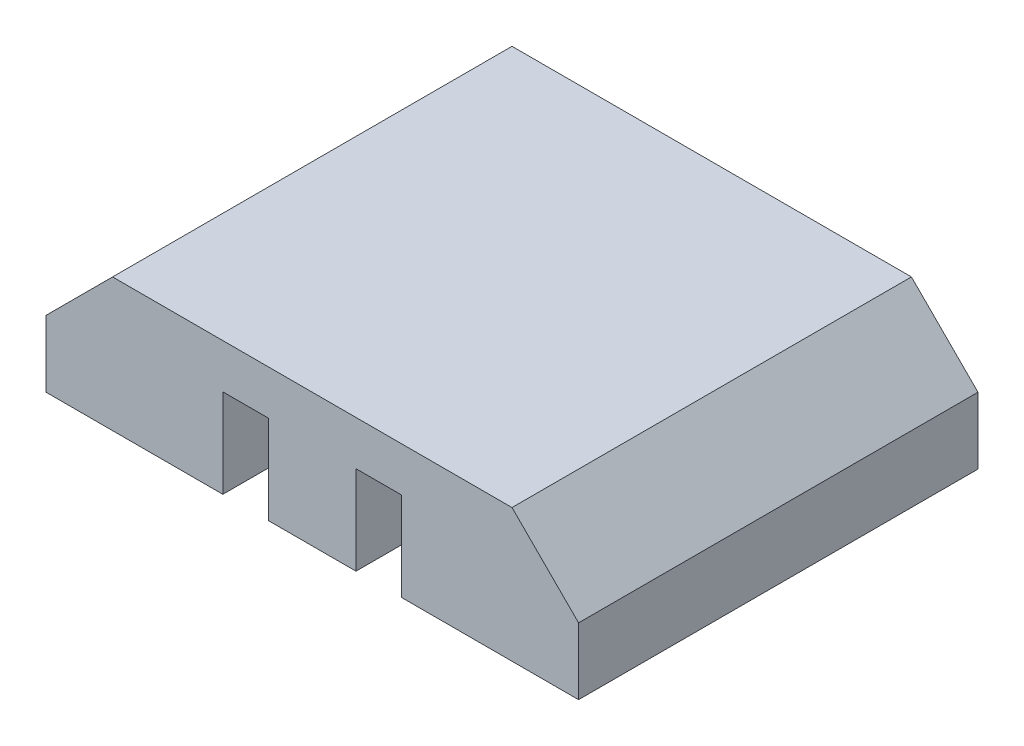
ISO-10303-21;
HEADER;
FILE_DESCRIPTION(('STEP AP214'),'2;1');
FILE_NAME('part.step','',(''),(''),'','','');
FILE_SCHEMA(('AUTOMOTIVE_DESIGN { 1 0 10303 214 1 1 1 1 }'));
ENDSEC;
DATA;
#1=APPLICATION_CONTEXT('core data for automotive mechanical design processes');
#2=APPLICATION_PROTOCOL_DEFINITION('international standard','automotive_design',2000,#1);
#3=PRODUCT_CONTEXT('',#1,'mechanical');
#4=PRODUCT('Part','Part','',(#3));
#5=PRODUCT_RELATED_PRODUCT_CATEGORY('part','',(#4));
#6=PRODUCT_DEFINITION_FORMATION('','',#4);
#7=PRODUCT_DEFINITION_CONTEXT('part definition',#1,'design');
#8=PRODUCT_DEFINITION('design','',#6,#7);
#9=PRODUCT_DEFINITION_SHAPE('','',#8);
#10=(LENGTH_UNIT() NAMED_UNIT(*) SI_UNIT(.MILLI.,.METRE.));
#11=(NAMED_UNIT(*) PLANE_ANGLE_UNIT() SI_UNIT($,.RADIAN.));
#12=(NAMED_UNIT(*) SI_UNIT($,.STERADIAN.) SOLID_ANGLE_UNIT());
#13=UNCERTAINTY_MEASURE_WITH_UNIT(LENGTH_MEASURE(1.E-05),#10,'distance_accuracy_value','');
#14=(GEOMETRIC_REPRESENTATION_CONTEXT(3) GLOBAL_UNCERTAINTY_ASSIGNED_CONTEXT((#13)) GLOBAL_UNIT_ASSIGNED_CONTEXT((#10,
#11,#12)) REPRESENTATION_CONTEXT('',''));
#15=CARTESIAN_POINT('',(0.,0.,0.));
#16=DIRECTION('',(0.,0.,1.));
#17=DIRECTION('',(1.,0.,0.));
#18=AXIS2_PLACEMENT_3D('',#15,#16,#17);
#19=CARTESIAN_POINT('',(0.,20.,-135.));
#20=DIRECTION('',(0.,0.,1.));
#21=DIRECTION('',(1.,0.,0.));
#22=AXIS2_PLACEMENT_3D('',#19,#20,#21);
#23=PLANE('',#22);
#24=DIRECTION('',(-0.707106781186547,-0.707106781186548,0.));
#25=VECTOR('',#24,1.);
#26=CARTESIAN_POINT('',(-7.5,27.5,-135.));
#27=LINE('',#26,#25);
#28=CARTESIAN_POINT('',(-5.,30.,-135.));
#29=VERTEX_POINT('',#28);
#30=CARTESIAN_POINT('',(-20.,15.,-135.));
#31=VERTEX_POINT('',#30);
#32=EDGE_CURVE('E158',#29,#31,#27,.T.);
#33=ORIENTED_EDGE('',*,*,#32,.F.);
#34=DIRECTION('',(-1.,0.,0.));
#35=VECTOR('',#34,1.);
#36=CARTESIAN_POINT('',(100.,30.,-135.));
#37=LINE('',#36,#35);
#38=CARTESIAN_POINT('',(84.9999999999999,30.,-135.));
#39=VERTEX_POINT('',#38);
#40=EDGE_CURVE('E191',#39,#29,#37,.T.);
#41=ORIENTED_EDGE('',*,*,#40,.F.);
#42=DIRECTION('',(-0.707106781186548,0.707106781186547,0.));
#43=VECTOR('',#42,1.);
#44=CARTESIAN_POINT('',(47.4999999999999,67.5,-135.));
#45=LINE('',#44,#43);
#46=CARTESIAN_POINT('',(100.,15.,-135.));
#47=VERTEX_POINT('',#46);
#48=EDGE_CURVE('E55',#47,#39,#45,.T.);
#49=ORIENTED_EDGE('',*,*,#48,.F.);
#50=DIRECTION('',(0.,-1.,0.));
#51=VECTOR('',#50,1.);
#52=CARTESIAN_POINT('',(100.,30.,-135.));
#53=LINE('',#52,#51);
#54=CARTESIAN_POINT('',(100.,0.,-135.));
#55=VERTEX_POINT('',#54);
#56=EDGE_CURVE('E209',#47,#55,#53,.T.);
#57=ORIENTED_EDGE('',*,*,#56,.T.);
#58=DIRECTION('',(1.,0.,0.));
#59=VECTOR('',#58,1.);
#60=CARTESIAN_POINT('',(0.,0.,-135.));
#61=LINE('',#60,#59);
#62=CARTESIAN_POINT('',(60.15,0.,-135.));
#63=VERTEX_POINT('',#62);
#64=EDGE_CURVE('E522',#63,#55,#61,.T.);
#65=ORIENTED_EDGE('',*,*,#64,.F.);
#66=DIRECTION('',(0.,-1.,0.));
#67=VECTOR('',#66,1.);
#68=CARTESIAN_POINT('',(60.15,20.,-135.));
#69=LINE('',#68,#67);
#70=CARTESIAN_POINT('',(60.15,20.,-135.));
#71=VERTEX_POINT('',#70);
#72=EDGE_CURVE('E253',#71,#63,#69,.T.);
#73=ORIENTED_EDGE('',*,*,#72,.F.);
#74=DIRECTION('',(-1.,0.,0.));
#75=VECTOR('',#74,1.);
#76=CARTESIAN_POINT('',(100.,20.,-135.));
#77=LINE('',#76,#75);
#78=CARTESIAN_POINT('',(49.85,20.,-135.));
#79=VERTEX_POINT('',#78);
#80=EDGE_CURVE('E205',#71,#79,#77,.T.);
#81=ORIENTED_EDGE('',*,*,#80,.T.);
#82=DIRECTION('',(0.,-1.,0.));
#83=VECTOR('',#82,1.);
#84=CARTESIAN_POINT('',(49.85,20.,-135.));
#85=LINE('',#84,#83);
#86=CARTESIAN_POINT('',(49.85,0.,-135.));
#87=VERTEX_POINT('',#86);
#88=EDGE_CURVE('E202',#79,#87,#85,.T.);
#89=ORIENTED_EDGE('',*,*,#88,.T.);
#90=DIRECTION('',(1.,0.,0.));
#91=VECTOR('',#90,1.);
#92=CARTESIAN_POINT('',(0.,0.,-135.));
#93=LINE('',#92,#91);
#94=CARTESIAN_POINT('',(30.15,0.,-135.));
#95=VERTEX_POINT('',#94);
#96=EDGE_CURVE('E279',#95,#87,#93,.T.);
#97=ORIENTED_EDGE('',*,*,#96,.F.);
#98=DIRECTION('',(0.,-1.,0.));
#99=VECTOR('',#98,1.);
#100=CARTESIAN_POINT('',(30.15,20.,-135.));
#101=LINE('',#100,#99);
#102=CARTESIAN_POINT('',(30.15,20.,-135.));
#103=VERTEX_POINT('',#102);
#104=EDGE_CURVE('E289',#103,#95,#101,.T.);
#105=ORIENTED_EDGE('',*,*,#104,.F.);
#106=CARTESIAN_POINT('',(19.85,20.,-135.));
#107=VERTEX_POINT('',#106);
#108=EDGE_CURVE('E206',#103,#107,#77,.T.);
#109=ORIENTED_EDGE('',*,*,#108,.T.);
#110=DIRECTION('',(0.,-1.,0.));
#111=VECTOR('',#110,1.);
#112=CARTESIAN_POINT('',(19.85,20.,-135.));
#113=LINE('',#112,#111);
#114=CARTESIAN_POINT('',(19.85,0.,-135.));
#115=VERTEX_POINT('',#114);
#116=EDGE_CURVE('E181',#107,#115,#113,.T.);
#117=ORIENTED_EDGE('',*,*,#116,.T.);
#118=DIRECTION('',(-1.,0.,0.));
#119=VECTOR('',#118,1.);
#120=CARTESIAN_POINT('',(0.,0.,-135.));
#121=LINE('',#120,#119);
#122=CARTESIAN_POINT('',(-20.,0.,-135.));
#123=VERTEX_POINT('',#122);
#124=EDGE_CURVE('E217',#115,#123,#121,.T.);
#125=ORIENTED_EDGE('',*,*,#124,.T.);
#126=DIRECTION('',(0.,-1.,0.));
#127=VECTOR('',#126,1.);
#128=CARTESIAN_POINT('',(-20.,20.,-135.));
#129=LINE('',#128,#127);
#130=EDGE_CURVE('E178',#31,#123,#129,.T.);
#131=ORIENTED_EDGE('',*,*,#130,.F.);
#132=EDGE_LOOP('',(#33,#41,#49,#57,#65,#73,#81,#89,#97,#105,#109,#117,#125,#131));
#133=FACE_BOUND('',#132,.T.);
#134=ADVANCED_FACE('F33',(#133),#23,.F.);
#135=CARTESIAN_POINT('',(-20.,20.,0.));
#136=DIRECTION('',(1.,0.,0.));
#137=DIRECTION('',(0.,0.,-1.));
#138=AXIS2_PLACEMENT_3D('',#135,#136,#137);
#139=PLANE('',#138);
#140=DIRECTION('',(0.,0.,1.));
#141=VECTOR('',#140,1.);
#142=CARTESIAN_POINT('',(-20.,15.,-159.));
#143=LINE('',#142,#141);
#144=CARTESIAN_POINT('',(-20.,15.,-45.));
#145=VERTEX_POINT('',#144);
#146=EDGE_CURVE('E155',#31,#145,#143,.T.);
#147=ORIENTED_EDGE('',*,*,#146,.F.);
#148=ORIENTED_EDGE('',*,*,#130,.T.);
#149=DIRECTION('',(0.,0.,1.));
#150=VECTOR('',#149,1.);
#151=CARTESIAN_POINT('',(-20.,0.,0.));
#152=LINE('',#151,#150);
#153=CARTESIAN_POINT('',(-20.,0.,-45.));
#154=VERTEX_POINT('',#153);
#155=EDGE_CURVE('E176',#123,#154,#152,.T.);
#156=ORIENTED_EDGE('',*,*,#155,.T.);
#157=DIRECTION('',(0.,-1.,0.));
#158=VECTOR('',#157,1.);
#159=CARTESIAN_POINT('',(-20.,20.,-45.));
#160=LINE('',#159,#158);
#161=EDGE_CURVE('E167',#145,#154,#160,.T.);
#162=ORIENTED_EDGE('',*,*,#161,.F.);
#163=EDGE_LOOP('',(#147,#148,#156,#162));
#164=FACE_BOUND('',#163,.T.);
#165=ADVANCED_FACE('F174',(#164),#139,.F.);
#166=CARTESIAN_POINT('',(0.,20.,-45.));
#167=DIRECTION('',(0.,0.,1.));
#168=DIRECTION('',(1.,0.,0.));
#169=AXIS2_PLACEMENT_3D('',#166,#167,#168);
#170=PLANE('',#169);
#171=DIRECTION('',(1.,0.,0.));
#172=VECTOR('',#171,1.);
#173=CARTESIAN_POINT('',(100.,30.,-45.));
#174=LINE('',#173,#172);
#175=CARTESIAN_POINT('',(-5.,30.,-45.));
#176=VERTEX_POINT('',#175);
#177=CARTESIAN_POINT('',(85.,30.,-45.));
#178=VERTEX_POINT('',#177);
#179=EDGE_CURVE('E171',#176,#178,#174,.T.);
#180=ORIENTED_EDGE('',*,*,#179,.F.);
#181=DIRECTION('',(-0.707106781186547,-0.707106781186548,0.));
#182=VECTOR('',#181,1.);
#183=CARTESIAN_POINT('',(-5.,30.,-45.));
#184=LINE('',#183,#182);
#185=EDGE_CURVE('E48',#176,#145,#184,.T.);
#186=ORIENTED_EDGE('',*,*,#185,.T.);
#187=ORIENTED_EDGE('',*,*,#161,.T.);
#188=DIRECTION('',(-1.,0.,0.));
#189=VECTOR('',#188,1.);
#190=CARTESIAN_POINT('',(0.,0.,-45.));
#191=LINE('',#190,#189);
#192=CARTESIAN_POINT('',(19.85,0.,-45.));
#193=VERTEX_POINT('',#192);
#194=EDGE_CURVE('E214',#193,#154,#191,.T.);
#195=ORIENTED_EDGE('',*,*,#194,.F.);
#196=DIRECTION('',(0.,-1.,0.));
#197=VECTOR('',#196,1.);
#198=CARTESIAN_POINT('',(19.85,20.,-45.));
#199=LINE('',#198,#197);
#200=CARTESIAN_POINT('',(19.85,20.,-45.));
#201=VERTEX_POINT('',#200);
#202=EDGE_CURVE('E179',#201,#193,#199,.T.);
#203=ORIENTED_EDGE('',*,*,#202,.F.);
#204=DIRECTION('',(1.,0.,0.));
#205=VECTOR('',#204,1.);
#206=CARTESIAN_POINT('',(100.,20.,-45.));
#207=LINE('',#206,#205);
#208=CARTESIAN_POINT('',(30.15,20.,-45.));
#209=VERTEX_POINT('',#208);
#210=EDGE_CURVE('E194',#201,#209,#207,.T.);
#211=ORIENTED_EDGE('',*,*,#210,.T.);
#212=DIRECTION('',(0.,-1.,0.));
#213=VECTOR('',#212,1.);
#214=CARTESIAN_POINT('',(30.15,20.,-45.));
#215=LINE('',#214,#213);
#216=CARTESIAN_POINT('',(30.15,0.,-45.));
#217=VERTEX_POINT('',#216);
#218=EDGE_CURVE('E243',#209,#217,#215,.T.);
#219=ORIENTED_EDGE('',*,*,#218,.T.);
#220=DIRECTION('',(1.,0.,0.));
#221=VECTOR('',#220,1.);
#222=CARTESIAN_POINT('',(0.,0.,-45.));
#223=LINE('',#222,#221);
#224=CARTESIAN_POINT('',(49.85,0.,-45.));
#225=VERTEX_POINT('',#224);
#226=EDGE_CURVE('E258',#217,#225,#223,.T.);
#227=ORIENTED_EDGE('',*,*,#226,.T.);
#228=DIRECTION('',(0.,-1.,0.));
#229=VECTOR('',#228,1.);
#230=CARTESIAN_POINT('',(49.85,20.,-45.));
#231=LINE('',#230,#229);
#232=CARTESIAN_POINT('',(49.85,20.,-45.));
#233=VERTEX_POINT('',#232);
#234=EDGE_CURVE('E241',#233,#225,#231,.T.);
#235=ORIENTED_EDGE('',*,*,#234,.F.);
#236=CARTESIAN_POINT('',(60.15,20.,-45.));
#237=VERTEX_POINT('',#236);
#238=EDGE_CURVE('E199',#233,#237,#207,.T.);
#239=ORIENTED_EDGE('',*,*,#238,.T.);
#240=DIRECTION('',(0.,-1.,0.));
#241=VECTOR('',#240,1.);
#242=CARTESIAN_POINT('',(60.15,20.,-45.));
#243=LINE('',#242,#241);
#244=CARTESIAN_POINT('',(60.15,0.,-45.));
#245=VERTEX_POINT('',#244);
#246=EDGE_CURVE('E534',#237,#245,#243,.T.);
#247=ORIENTED_EDGE('',*,*,#246,.T.);
#248=DIRECTION('',(1.,0.,0.));
#249=VECTOR('',#248,1.);
#250=CARTESIAN_POINT('',(0.,0.,-44.9999999999999));
#251=LINE('',#250,#249);
#252=CARTESIAN_POINT('',(100.,0.,-45.));
#253=VERTEX_POINT('',#252);
#254=EDGE_CURVE('E532',#245,#253,#251,.T.);
#255=ORIENTED_EDGE('',*,*,#254,.T.);
#256=DIRECTION('',(0.,-1.,0.));
#257=VECTOR('',#256,1.);
#258=CARTESIAN_POINT('',(100.,30.,-45.));
#259=LINE('',#258,#257);
#260=CARTESIAN_POINT('',(100.,15.,-45.));
#261=VERTEX_POINT('',#260);
#262=EDGE_CURVE('E196',#261,#253,#259,.T.);
#263=ORIENTED_EDGE('',*,*,#262,.F.);
#264=DIRECTION('',(-0.707106781186548,0.707106781186547,0.));
#265=VECTOR('',#264,1.);
#266=CARTESIAN_POINT('',(100.,15.,-45.));
#267=LINE('',#266,#265);
#268=EDGE_CURVE('E172',#261,#178,#267,.T.);
#269=ORIENTED_EDGE('',*,*,#268,.T.);
#270=EDGE_LOOP('',(#180,#186,#187,#195,#203,#211,#219,#227,#235,#239,#247,#255,#263,#269));
#271=FACE_BOUND('',#270,.T.);
#272=ADVANCED_FACE('F165',(#271),#170,.T.);
#273=CARTESIAN_POINT('',(100.,30.,-45.));
#274=DIRECTION('',(-1.,0.,0.));
#275=DIRECTION('',(0.,0.,1.));
#276=AXIS2_PLACEMENT_3D('',#273,#274,#275);
#277=PLANE('',#276);
#278=DIRECTION('',(0.,0.,1.));
#279=VECTOR('',#278,1.);
#280=CARTESIAN_POINT('',(100.,15.,-159.));
#281=LINE('',#280,#279);
#282=EDGE_CURVE('E547',#47,#261,#281,.T.);
#283=ORIENTED_EDGE('',*,*,#282,.T.);
#284=ORIENTED_EDGE('',*,*,#262,.T.);
#285=DIRECTION('',(0.,0.,1.));
#286=VECTOR('',#285,1.);
#287=CARTESIAN_POINT('',(100.,0.,0.));
#288=LINE('',#287,#286);
#289=EDGE_CURVE('E525',#55,#253,#288,.T.);
#290=ORIENTED_EDGE('',*,*,#289,.F.);
#291=ORIENTED_EDGE('',*,*,#56,.F.);
#292=EDGE_LOOP('',(#283,#284,#290,#291));
#293=FACE_BOUND('',#292,.T.);
#294=ADVANCED_FACE('F327',(#293),#277,.F.);
#295=CARTESIAN_POINT('',(0.,30.,0.));
#296=DIRECTION('',(0.,1.,0.));
#297=DIRECTION('',(0.,0.,1.));
#298=AXIS2_PLACEMENT_3D('',#295,#296,#297);
#299=PLANE('',#298);
#300=ORIENTED_EDGE('',*,*,#40,.T.);
#301=DIRECTION('',(0.,0.,1.));
#302=VECTOR('',#301,1.);
#303=CARTESIAN_POINT('',(-5.,30.,0.));
#304=LINE('',#303,#302);
#305=EDGE_CURVE('E11',#29,#176,#304,.T.);
#306=ORIENTED_EDGE('',*,*,#305,.T.);
#307=ORIENTED_EDGE('',*,*,#179,.T.);
#308=DIRECTION('',(0.,0.,-1.));
#309=VECTOR('',#308,1.);
#310=CARTESIAN_POINT('',(84.9999999999999,30.,0.));
#311=LINE('',#310,#309);
#312=EDGE_CURVE('E41',#178,#39,#311,.T.);
#313=ORIENTED_EDGE('',*,*,#312,.T.);
#314=EDGE_LOOP('',(#300,#306,#307,#313));
#315=FACE_BOUND('',#314,.T.);
#316=ADVANCED_FACE('F190',(#315),#299,.T.);
#317=CARTESIAN_POINT('',(0.,20.,0.));
#318=DIRECTION('',(0.,1.,0.));
#319=DIRECTION('',(0.,0.,1.));
#320=AXIS2_PLACEMENT_3D('',#317,#318,#319);
#321=PLANE('',#320);
#322=DIRECTION('',(0.,0.,1.));
#323=VECTOR('',#322,1.);
#324=CARTESIAN_POINT('',(60.15,20.,0.));
#325=LINE('',#324,#323);
#326=EDGE_CURVE('E531',#71,#237,#325,.T.);
#327=ORIENTED_EDGE('',*,*,#326,.T.);
#328=ORIENTED_EDGE('',*,*,#238,.F.);
#329=DIRECTION('',(0.,0.,1.));
#330=VECTOR('',#329,1.);
#331=CARTESIAN_POINT('',(49.8499999999979,20.,2.30602574073178E-12));
#332=LINE('',#331,#330);
#333=CARTESIAN_POINT('',(49.85,20.,-84.85));
#334=VERTEX_POINT('',#333);
#335=EDGE_CURVE('E245',#334,#233,#332,.T.);
#336=ORIENTED_EDGE('',*,*,#335,.F.);
#337=DIRECTION('',(1.,0.,0.));
#338=VECTOR('',#337,1.);
#339=CARTESIAN_POINT('',(0.,20.,-84.85));
#340=LINE('',#339,#338);
#341=CARTESIAN_POINT('',(30.15,20.,-84.85));
#342=VERTEX_POINT('',#341);
#343=EDGE_CURVE('E239',#342,#334,#340,.T.);
#344=ORIENTED_EDGE('',*,*,#343,.F.);
#345=DIRECTION('',(0.,0.,1.));
#346=VECTOR('',#345,1.);
#347=CARTESIAN_POINT('',(30.15,20.,0.));
#348=LINE('',#347,#346);
#349=EDGE_CURVE('E236',#342,#209,#348,.T.);
#350=ORIENTED_EDGE('',*,*,#349,.T.);
#351=ORIENTED_EDGE('',*,*,#210,.F.);
#352=DIRECTION('',(0.,0.,1.));
#353=VECTOR('',#352,1.);
#354=CARTESIAN_POINT('',(19.85,20.,0.));
#355=LINE('',#354,#353);
#356=EDGE_CURVE('E183',#107,#201,#355,.T.);
#357=ORIENTED_EDGE('',*,*,#356,.F.);
#358=ORIENTED_EDGE('',*,*,#108,.F.);
#359=DIRECTION('',(0.,0.,-1.));
#360=VECTOR('',#359,1.);
#361=CARTESIAN_POINT('',(30.15,20.,0.));
#362=LINE('',#361,#360);
#363=CARTESIAN_POINT('',(30.15,20.,-95.15));
#364=VERTEX_POINT('',#363);
#365=EDGE_CURVE('E270',#364,#103,#362,.T.);
#366=ORIENTED_EDGE('',*,*,#365,.F.);
#367=DIRECTION('',(1.,0.,0.));
#368=VECTOR('',#367,1.);
#369=CARTESIAN_POINT('',(0.,20.,-95.15));
#370=LINE('',#369,#368);
#371=CARTESIAN_POINT('',(49.85,20.,-95.15));
#372=VERTEX_POINT('',#371);
#373=EDGE_CURVE('E274',#364,#372,#370,.T.);
#374=ORIENTED_EDGE('',*,*,#373,.T.);
#375=DIRECTION('',(0.,0.,-1.));
#376=VECTOR('',#375,1.);
#377=CARTESIAN_POINT('',(49.85,20.,0.));
#378=LINE('',#377,#376);
#379=EDGE_CURVE('E267',#372,#79,#378,.T.);
#380=ORIENTED_EDGE('',*,*,#379,.T.);
#381=ORIENTED_EDGE('',*,*,#80,.F.);
#382=EDGE_LOOP('',(#327,#328,#336,#344,#350,#351,#357,#358,#366,#374,#380,#381));
#383=FACE_BOUND('',#382,.T.);
#384=ADVANCED_FACE('F231',(#383),#321,.F.);
#385=CARTESIAN_POINT('',(19.85,20.,0.));
#386=DIRECTION('',(1.,0.,0.));
#387=DIRECTION('',(0.,0.,-1.));
#388=AXIS2_PLACEMENT_3D('',#385,#386,#387);
#389=PLANE('',#388);
#390=DIRECTION('',(0.,0.,1.));
#391=VECTOR('',#390,1.);
#392=CARTESIAN_POINT('',(19.85,0.,0.));
#393=LINE('',#392,#391);
#394=EDGE_CURVE('E211',#115,#193,#393,.T.);
#395=ORIENTED_EDGE('',*,*,#394,.F.);
#396=ORIENTED_EDGE('',*,*,#116,.F.);
#397=ORIENTED_EDGE('',*,*,#356,.T.);
#398=ORIENTED_EDGE('',*,*,#202,.T.);
#399=EDGE_LOOP('',(#395,#396,#397,#398));
#400=FACE_BOUND('',#399,.T.);
#401=ADVANCED_FACE('F35',(#400),#389,.T.);
#402=CARTESIAN_POINT('',(0.,0.,0.));
#403=DIRECTION('',(0.,1.,0.));
#404=DIRECTION('',(0.,0.,1.));
#405=AXIS2_PLACEMENT_3D('',#402,#403,#404);
#406=PLANE('',#405);
#407=ORIENTED_EDGE('',*,*,#394,.T.);
#408=ORIENTED_EDGE('',*,*,#194,.T.);
#409=ORIENTED_EDGE('',*,*,#155,.F.);
#410=ORIENTED_EDGE('',*,*,#124,.F.);
#411=EDGE_LOOP('',(#407,#408,#409,#410));
#412=FACE_BOUND('',#411,.T.);
#413=ADVANCED_FACE('F221',(#412),#406,.F.);
#414=CARTESIAN_POINT('',(49.85,20.,0.));
#415=DIRECTION('',(-1.,0.,0.));
#416=DIRECTION('',(0.,0.,1.));
#417=AXIS2_PLACEMENT_3D('',#414,#415,#416);
#418=PLANE('',#417);
#419=DIRECTION('',(0.,0.,-1.));
#420=VECTOR('',#419,1.);
#421=CARTESIAN_POINT('',(49.85,0.,0.));
#422=LINE('',#421,#420);
#423=CARTESIAN_POINT('',(49.85,0.,-95.15));
#424=VERTEX_POINT('',#423);
#425=EDGE_CURVE('E266',#424,#87,#422,.T.);
#426=ORIENTED_EDGE('',*,*,#425,.T.);
#427=ORIENTED_EDGE('',*,*,#88,.F.);
#428=ORIENTED_EDGE('',*,*,#379,.F.);
#429=DIRECTION('',(0.,-1.,0.));
#430=VECTOR('',#429,1.);
#431=CARTESIAN_POINT('',(49.85,20.,-95.15));
#432=LINE('',#431,#430);
#433=EDGE_CURVE('E276',#372,#424,#432,.T.);
#434=ORIENTED_EDGE('',*,*,#433,.T.);
#435=EDGE_LOOP('',(#426,#427,#428,#434));
#436=FACE_BOUND('',#435,.T.);
#437=ADVANCED_FACE('F305',(#436),#418,.F.);
#438=CARTESIAN_POINT('',(30.15,20.,0.));
#439=DIRECTION('',(-1.,0.,0.));
#440=DIRECTION('',(0.,0.,1.));
#441=AXIS2_PLACEMENT_3D('',#438,#439,#440);
#442=PLANE('',#441);
#443=DIRECTION('',(0.,0.,-1.));
#444=VECTOR('',#443,1.);
#445=CARTESIAN_POINT('',(30.15,0.,0.));
#446=LINE('',#445,#444);
#447=CARTESIAN_POINT('',(30.15,0.,-95.15));
#448=VERTEX_POINT('',#447);
#449=EDGE_CURVE('E282',#448,#95,#446,.T.);
#450=ORIENTED_EDGE('',*,*,#449,.F.);
#451=DIRECTION('',(0.,-1.,0.));
#452=VECTOR('',#451,1.);
#453=CARTESIAN_POINT('',(30.15,20.,-95.15));
#454=LINE('',#453,#452);
#455=EDGE_CURVE('E288',#364,#448,#454,.T.);
#456=ORIENTED_EDGE('',*,*,#455,.F.);
#457=ORIENTED_EDGE('',*,*,#365,.T.);
#458=ORIENTED_EDGE('',*,*,#104,.T.);
#459=EDGE_LOOP('',(#450,#456,#457,#458));
#460=FACE_BOUND('',#459,.T.);
#461=ADVANCED_FACE('F295',(#460),#442,.T.);
#462=CARTESIAN_POINT('',(0.,20.,-95.15));
#463=DIRECTION('',(0.,0.,-1.));
#464=DIRECTION('',(-1.,0.,0.));
#465=AXIS2_PLACEMENT_3D('',#462,#463,#464);
#466=PLANE('',#465);
#467=DIRECTION('',(1.,0.,0.));
#468=VECTOR('',#467,1.);
#469=CARTESIAN_POINT('',(0.,0.,-95.15));
#470=LINE('',#469,#468);
#471=EDGE_CURVE('E271',#448,#424,#470,.T.);
#472=ORIENTED_EDGE('',*,*,#471,.T.);
#473=ORIENTED_EDGE('',*,*,#433,.F.);
#474=ORIENTED_EDGE('',*,*,#373,.F.);
#475=ORIENTED_EDGE('',*,*,#455,.T.);
#476=EDGE_LOOP('',(#472,#473,#474,#475));
#477=FACE_BOUND('',#476,.T.);
#478=ADVANCED_FACE('F301',(#477),#466,.F.);
#479=CARTESIAN_POINT('',(0.,0.,0.));
#480=DIRECTION('',(0.,1.,0.));
#481=DIRECTION('',(0.,0.,1.));
#482=AXIS2_PLACEMENT_3D('',#479,#480,#481);
#483=PLANE('',#482);
#484=ORIENTED_EDGE('',*,*,#425,.F.);
#485=ORIENTED_EDGE('',*,*,#471,.F.);
#486=ORIENTED_EDGE('',*,*,#449,.T.);
#487=ORIENTED_EDGE('',*,*,#96,.T.);
#488=EDGE_LOOP('',(#484,#485,#486,#487));
#489=FACE_BOUND('',#488,.T.);
#490=ADVANCED_FACE('F307',(#489),#483,.F.);
#491=CARTESIAN_POINT('',(49.8499999999979,20.,2.30602574073178E-12));
#492=DIRECTION('',(1.,0.,0.));
#493=DIRECTION('',(0.,0.,-1.));
#494=AXIS2_PLACEMENT_3D('',#491,#492,#493);
#495=PLANE('',#494);
#496=DIRECTION('',(0.,0.,1.));
#497=VECTOR('',#496,1.);
#498=CARTESIAN_POINT('',(49.8499999999979,0.,2.30602574073178E-12));
#499=LINE('',#498,#497);
#500=CARTESIAN_POINT('',(49.85,0.,-84.85));
#501=VERTEX_POINT('',#500);
#502=EDGE_CURVE('E249',#501,#225,#499,.T.);
#503=ORIENTED_EDGE('',*,*,#502,.F.);
#504=DIRECTION('',(0.,-1.,0.));
#505=VECTOR('',#504,1.);
#506=CARTESIAN_POINT('',(49.85,20.,-84.85));
#507=LINE('',#506,#505);
#508=EDGE_CURVE('E264',#334,#501,#507,.T.);
#509=ORIENTED_EDGE('',*,*,#508,.F.);
#510=ORIENTED_EDGE('',*,*,#335,.T.);
#511=ORIENTED_EDGE('',*,*,#234,.T.);
#512=EDGE_LOOP('',(#503,#509,#510,#511));
#513=FACE_BOUND('',#512,.T.);
#514=ADVANCED_FACE('F309',(#513),#495,.T.);
#515=CARTESIAN_POINT('',(0.,20.,-84.85));
#516=DIRECTION('',(0.,0.,-1.));
#517=DIRECTION('',(-1.,0.,0.));
#518=AXIS2_PLACEMENT_3D('',#515,#516,#517);
#519=PLANE('',#518);
#520=DIRECTION('',(1.,0.,0.));
#521=VECTOR('',#520,1.);
#522=CARTESIAN_POINT('',(0.,0.,-84.85));
#523=LINE('',#522,#521);
#524=CARTESIAN_POINT('',(30.15,0.,-84.85));
#525=VERTEX_POINT('',#524);
#526=EDGE_CURVE('E252',#525,#501,#523,.T.);
#527=ORIENTED_EDGE('',*,*,#526,.F.);
#528=DIRECTION('',(0.,-1.,0.));
#529=VECTOR('',#528,1.);
#530=CARTESIAN_POINT('',(30.15,20.,-84.85));
#531=LINE('',#530,#529);
#532=EDGE_CURVE('E262',#342,#525,#531,.T.);
#533=ORIENTED_EDGE('',*,*,#532,.F.);
#534=ORIENTED_EDGE('',*,*,#343,.T.);
#535=ORIENTED_EDGE('',*,*,#508,.T.);
#536=EDGE_LOOP('',(#527,#533,#534,#535));
#537=FACE_BOUND('',#536,.T.);
#538=ADVANCED_FACE('F315',(#537),#519,.T.);
#539=CARTESIAN_POINT('',(30.15,20.,0.));
#540=DIRECTION('',(1.,0.,0.));
#541=DIRECTION('',(0.,0.,-1.));
#542=AXIS2_PLACEMENT_3D('',#539,#540,#541);
#543=PLANE('',#542);
#544=DIRECTION('',(0.,0.,1.));
#545=VECTOR('',#544,1.);
#546=CARTESIAN_POINT('',(30.15,0.,0.));
#547=LINE('',#546,#545);
#548=EDGE_CURVE('E256',#525,#217,#547,.T.);
#549=ORIENTED_EDGE('',*,*,#548,.T.);
#550=ORIENTED_EDGE('',*,*,#218,.F.);
#551=ORIENTED_EDGE('',*,*,#349,.F.);
#552=ORIENTED_EDGE('',*,*,#532,.T.);
#553=EDGE_LOOP('',(#549,#550,#551,#552));
#554=FACE_BOUND('',#553,.T.);
#555=ADVANCED_FACE('F369',(#554),#543,.F.);
#556=CARTESIAN_POINT('',(0.,0.,0.));
#557=DIRECTION('',(0.,1.,0.));
#558=DIRECTION('',(0.,0.,1.));
#559=AXIS2_PLACEMENT_3D('',#556,#557,#558);
#560=PLANE('',#559);
#561=ORIENTED_EDGE('',*,*,#502,.T.);
#562=ORIENTED_EDGE('',*,*,#226,.F.);
#563=ORIENTED_EDGE('',*,*,#548,.F.);
#564=ORIENTED_EDGE('',*,*,#526,.T.);
#565=EDGE_LOOP('',(#561,#562,#563,#564));
#566=FACE_BOUND('',#565,.T.);
#567=ADVANCED_FACE('F379',(#566),#560,.F.);
#568=CARTESIAN_POINT('',(60.15,20.,0.));
#569=DIRECTION('',(1.,0.,0.));
#570=DIRECTION('',(0.,0.,-1.));
#571=AXIS2_PLACEMENT_3D('',#568,#569,#570);
#572=PLANE('',#571);
#573=DIRECTION('',(0.,0.,1.));
#574=VECTOR('',#573,1.);
#575=CARTESIAN_POINT('',(60.15,0.,0.));
#576=LINE('',#575,#574);
#577=EDGE_CURVE('E526',#63,#245,#576,.T.);
#578=ORIENTED_EDGE('',*,*,#577,.T.);
#579=ORIENTED_EDGE('',*,*,#246,.F.);
#580=ORIENTED_EDGE('',*,*,#326,.F.);
#581=ORIENTED_EDGE('',*,*,#72,.T.);
#582=EDGE_LOOP('',(#578,#579,#580,#581));
#583=FACE_BOUND('',#582,.T.);
#584=ADVANCED_FACE('F389',(#583),#572,.F.);
#585=CARTESIAN_POINT('',(0.,0.,0.));
#586=DIRECTION('',(0.,1.,0.));
#587=DIRECTION('',(0.,0.,1.));
#588=AXIS2_PLACEMENT_3D('',#585,#586,#587);
#589=PLANE('',#588);
#590=ORIENTED_EDGE('',*,*,#64,.T.);
#591=ORIENTED_EDGE('',*,*,#289,.T.);
#592=ORIENTED_EDGE('',*,*,#254,.F.);
#593=ORIENTED_EDGE('',*,*,#577,.F.);
#594=EDGE_LOOP('',(#590,#591,#592,#593));
#595=FACE_BOUND('',#594,.T.);
#596=ADVANCED_FACE('F399',(#595),#589,.F.);
#597=CARTESIAN_POINT('',(100.,15.,-159.));
#598=DIRECTION('',(0.707106781186547,0.707106781186548,0.));
#599=DIRECTION('',(-0.707106781186548,0.707106781186547,0.));
#600=AXIS2_PLACEMENT_3D('',#597,#598,#599);
#601=PLANE('',#600);
#602=ORIENTED_EDGE('',*,*,#48,.T.);
#603=ORIENTED_EDGE('',*,*,#312,.F.);
#604=ORIENTED_EDGE('',*,*,#268,.F.);
#605=ORIENTED_EDGE('',*,*,#282,.F.);
#606=EDGE_LOOP('',(#602,#603,#604,#605));
#607=FACE_BOUND('',#606,.T.);
#608=ADVANCED_FACE('F408',(#607),#601,.T.);
#609=CARTESIAN_POINT('',(-5.,30.,-159.));
#610=DIRECTION('',(-0.707106781186548,0.707106781186547,0.));
#611=DIRECTION('',(-0.707106781186547,-0.707106781186548,0.));
#612=AXIS2_PLACEMENT_3D('',#609,#610,#611);
#613=PLANE('',#612);
#614=ORIENTED_EDGE('',*,*,#32,.T.);
#615=ORIENTED_EDGE('',*,*,#146,.T.);
#616=ORIENTED_EDGE('',*,*,#185,.F.);
#617=ORIENTED_EDGE('',*,*,#305,.F.);
#618=EDGE_LOOP('',(#614,#615,#616,#617));
#619=FACE_BOUND('',#618,.T.);
#620=ADVANCED_FACE('F156',(#619),#613,.T.);
#621=CLOSED_SHELL('',(#134,#165,#272,#294,#316,#384,#401,#413,#437,#461,#478,#490,#514,#538,
#555,#567,#584,#596,#608,#620));
#622=MANIFOLD_SOLID_BREP('B2',#621);
#623=ADVANCED_BREP_SHAPE_REPRESENTATION('',(#18,#622),#14);
#624=SHAPE_DEFINITION_REPRESENTATION(#9,#623);
ENDSEC;
END-ISO-10303-21;
